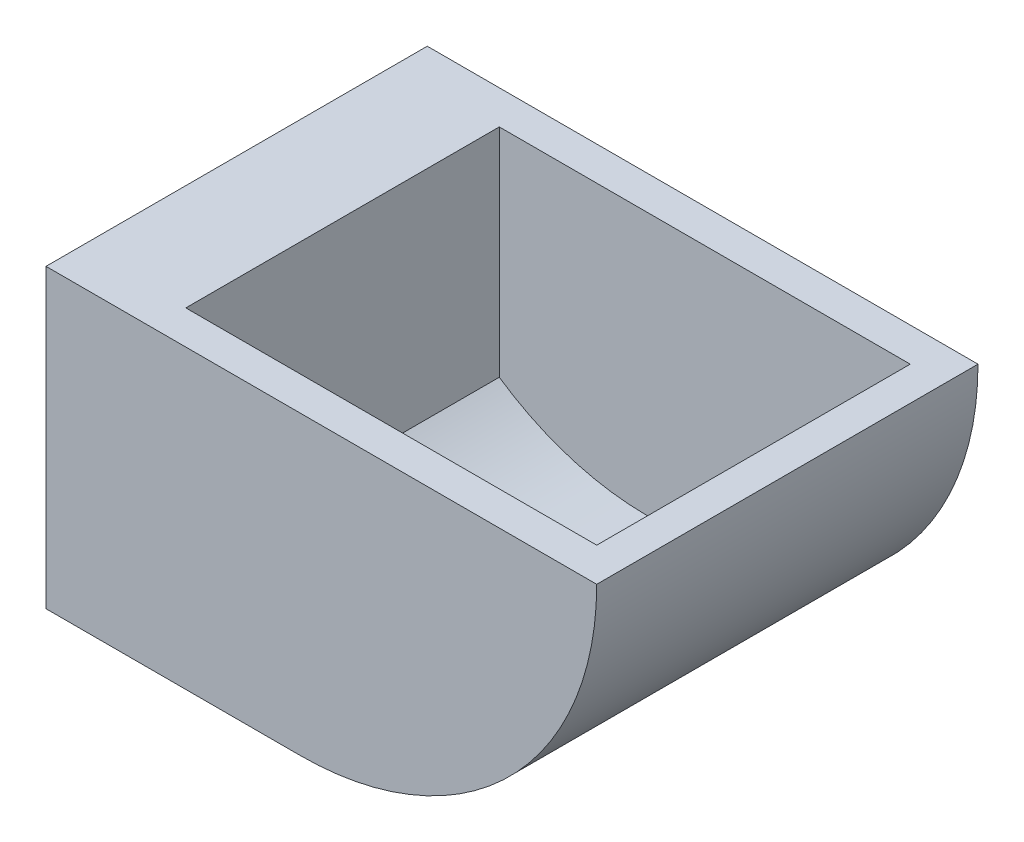
ISO-10303-21;
HEADER;
FILE_DESCRIPTION(('STEP AP214'),'2;1');
FILE_NAME('part.step','',(''),(''),'','','');
FILE_SCHEMA(('AUTOMOTIVE_DESIGN { 1 0 10303 214 1 1 1 1 }'));
ENDSEC;
DATA;
#1=APPLICATION_CONTEXT('core data for automotive mechanical design processes');
#2=APPLICATION_PROTOCOL_DEFINITION('international standard','automotive_design',2000,#1);
#3=PRODUCT_CONTEXT('',#1,'mechanical');
#4=PRODUCT('Part','Part','',(#3));
#5=PRODUCT_RELATED_PRODUCT_CATEGORY('part','',(#4));
#6=PRODUCT_DEFINITION_FORMATION('','',#4);
#7=PRODUCT_DEFINITION_CONTEXT('part definition',#1,'design');
#8=PRODUCT_DEFINITION('design','',#6,#7);
#9=PRODUCT_DEFINITION_SHAPE('','',#8);
#10=(LENGTH_UNIT() NAMED_UNIT(*) SI_UNIT(.MILLI.,.METRE.));
#11=(NAMED_UNIT(*) PLANE_ANGLE_UNIT() SI_UNIT($,.RADIAN.));
#12=(NAMED_UNIT(*) SI_UNIT($,.STERADIAN.) SOLID_ANGLE_UNIT());
#13=UNCERTAINTY_MEASURE_WITH_UNIT(LENGTH_MEASURE(1.E-05),#10,'distance_accuracy_value','');
#14=(GEOMETRIC_REPRESENTATION_CONTEXT(3) GLOBAL_UNCERTAINTY_ASSIGNED_CONTEXT((#13)) GLOBAL_UNIT_ASSIGNED_CONTEXT((#10,
#11,#12)) REPRESENTATION_CONTEXT('',''));
#15=CARTESIAN_POINT('',(0.,0.,0.));
#16=DIRECTION('',(0.,0.,1.));
#17=DIRECTION('',(1.,0.,0.));
#18=AXIS2_PLACEMENT_3D('',#15,#16,#17);
#19=CARTESIAN_POINT('',(0.,0.,45.));
#20=DIRECTION('',(0.,0.,-1.));
#21=DIRECTION('',(-1.,0.,0.));
#22=AXIS2_PLACEMENT_3D('',#19,#20,#21);
#23=CYLINDRICAL_SURFACE('',#22,35.);
#24=CARTESIAN_POINT('',(0.,0.,45.));
#25=DIRECTION('',(0.,0.,1.));
#26=DIRECTION('',(1.,0.,0.));
#27=AXIS2_PLACEMENT_3D('',#24,#25,#26);
#28=CIRCLE('',#27,35.);
#29=CARTESIAN_POINT('',(0.,-35.,45.));
#30=VERTEX_POINT('',#29);
#31=CARTESIAN_POINT('',(35.,0.,45.));
#32=VERTEX_POINT('',#31);
#33=EDGE_CURVE('E125',#30,#32,#28,.T.);
#34=ORIENTED_EDGE('',*,*,#33,.F.);
#35=DIRECTION('',(0.,0.,1.));
#36=VECTOR('',#35,1.);
#37=CARTESIAN_POINT('',(0.,-35.,0.));
#38=LINE('',#37,#36);
#39=CARTESIAN_POINT('',(0.,-35.,0.));
#40=VERTEX_POINT('',#39);
#41=EDGE_CURVE('E178',#40,#30,#38,.T.);
#42=ORIENTED_EDGE('',*,*,#41,.F.);
#43=CARTESIAN_POINT('',(0.,0.,0.));
#44=DIRECTION('',(0.,0.,1.));
#45=DIRECTION('',(1.,0.,0.));
#46=AXIS2_PLACEMENT_3D('',#43,#44,#45);
#47=CIRCLE('',#46,35.);
#48=CARTESIAN_POINT('',(35.,0.,0.));
#49=VERTEX_POINT('',#48);
#50=EDGE_CURVE('E128',#40,#49,#47,.T.);
#51=ORIENTED_EDGE('',*,*,#50,.T.);
#52=DIRECTION('',(0.,0.,-1.));
#53=VECTOR('',#52,1.);
#54=CARTESIAN_POINT('',(35.,0.,45.));
#55=LINE('',#54,#53);
#56=EDGE_CURVE('E132',#32,#49,#55,.T.);
#57=ORIENTED_EDGE('',*,*,#56,.F.);
#58=EDGE_LOOP('',(#34,#42,#51,#57));
#59=FACE_BOUND('',#58,.T.);
#60=ADVANCED_FACE('F47',(#59),#23,.T.);
#61=CARTESIAN_POINT('',(0.,0.,4.));
#62=DIRECTION('',(0.,0.,1.));
#63=DIRECTION('',(1.,0.,0.));
#64=AXIS2_PLACEMENT_3D('',#61,#62,#63);
#65=PLANE('',#64);
#66=DIRECTION('',(1.,0.,0.));
#67=VECTOR('',#66,1.);
#68=CARTESIAN_POINT('',(0.,0.,4.));
#69=LINE('',#68,#67);
#70=CARTESIAN_POINT('',(-17.5,0.,4.));
#71=VERTEX_POINT('',#70);
#72=CARTESIAN_POINT('',(31.,0.,4.));
#73=VERTEX_POINT('',#72);
#74=EDGE_CURVE('E57',#71,#73,#69,.T.);
#75=ORIENTED_EDGE('',*,*,#74,.F.);
#76=DIRECTION('',(0.,-1.,0.));
#77=VECTOR('',#76,1.);
#78=CARTESIAN_POINT('',(-17.5,0.,4.));
#79=LINE('',#78,#77);
#80=CARTESIAN_POINT('',(-17.5,-25.588083163848,4.));
#81=VERTEX_POINT('',#80);
#82=EDGE_CURVE('E168',#71,#81,#79,.T.);
#83=ORIENTED_EDGE('',*,*,#82,.T.);
#84=CARTESIAN_POINT('',(0.,0.,4.));
#85=DIRECTION('',(0.,0.,-1.));
#86=DIRECTION('',(-1.,0.,0.));
#87=AXIS2_PLACEMENT_3D('',#84,#85,#86);
#88=CIRCLE('',#87,31.);
#89=EDGE_CURVE('E137',#73,#81,#88,.T.);
#90=ORIENTED_EDGE('',*,*,#89,.F.);
#91=EDGE_LOOP('',(#75,#83,#90));
#92=FACE_BOUND('',#91,.T.);
#93=ADVANCED_FACE('F167',(#92),#65,.T.);
#94=CARTESIAN_POINT('',(0.,0.,0.));
#95=DIRECTION('',(0.,0.,-1.));
#96=DIRECTION('',(-1.,0.,0.));
#97=AXIS2_PLACEMENT_3D('',#94,#95,#96);
#98=CYLINDRICAL_SURFACE('',#97,31.);
#99=DIRECTION('',(0.,0.,-1.));
#100=VECTOR('',#99,1.);
#101=CARTESIAN_POINT('',(-17.5,-25.588083163848,0.));
#102=LINE('',#101,#100);
#103=CARTESIAN_POINT('',(-17.5,-25.588083163848,41.));
#104=VERTEX_POINT('',#103);
#105=EDGE_CURVE('E173',#104,#81,#102,.T.);
#106=ORIENTED_EDGE('',*,*,#105,.F.);
#107=CARTESIAN_POINT('',(0.,0.,41.));
#108=DIRECTION('',(0.,0.,-1.));
#109=DIRECTION('',(-1.,0.,0.));
#110=AXIS2_PLACEMENT_3D('',#107,#108,#109);
#111=CIRCLE('',#110,31.);
#112=CARTESIAN_POINT('',(31.,0.,41.));
#113=VERTEX_POINT('',#112);
#114=EDGE_CURVE('E166',#113,#104,#111,.T.);
#115=ORIENTED_EDGE('',*,*,#114,.F.);
#116=DIRECTION('',(0.,0.,-1.));
#117=VECTOR('',#116,1.);
#118=CARTESIAN_POINT('',(31.,0.,0.));
#119=LINE('',#118,#117);
#120=EDGE_CURVE('E147',#113,#73,#119,.T.);
#121=ORIENTED_EDGE('',*,*,#120,.T.);
#122=ORIENTED_EDGE('',*,*,#89,.T.);
#123=EDGE_LOOP('',(#106,#115,#121,#122));
#124=FACE_BOUND('',#123,.T.);
#125=ADVANCED_FACE('F164',(#124),#98,.F.);
#126=CARTESIAN_POINT('',(0.,0.,41.));
#127=DIRECTION('',(0.,0.,1.));
#128=DIRECTION('',(1.,0.,0.));
#129=AXIS2_PLACEMENT_3D('',#126,#127,#128);
#130=PLANE('',#129);
#131=DIRECTION('',(0.,-1.,0.));
#132=VECTOR('',#131,1.);
#133=CARTESIAN_POINT('',(-17.5,0.,41.));
#134=LINE('',#133,#132);
#135=CARTESIAN_POINT('',(-17.5,0.,41.));
#136=VERTEX_POINT('',#135);
#137=EDGE_CURVE('E11',#136,#104,#134,.T.);
#138=ORIENTED_EDGE('',*,*,#137,.F.);
#139=DIRECTION('',(1.,0.,0.));
#140=VECTOR('',#139,1.);
#141=CARTESIAN_POINT('',(0.,0.,41.));
#142=LINE('',#141,#140);
#143=EDGE_CURVE('E144',#136,#113,#142,.T.);
#144=ORIENTED_EDGE('',*,*,#143,.T.);
#145=ORIENTED_EDGE('',*,*,#114,.T.);
#146=EDGE_LOOP('',(#138,#144,#145));
#147=FACE_BOUND('',#146,.T.);
#148=ADVANCED_FACE('F242',(#147),#130,.F.);
#149=CARTESIAN_POINT('',(0.,0.,45.));
#150=DIRECTION('',(0.,1.,0.));
#151=DIRECTION('',(0.,0.,1.));
#152=AXIS2_PLACEMENT_3D('',#149,#150,#151);
#153=PLANE('',#152);
#154=DIRECTION('',(0.,0.,-1.));
#155=VECTOR('',#154,1.);
#156=CARTESIAN_POINT('',(-30.,0.,45.));
#157=LINE('',#156,#155);
#158=CARTESIAN_POINT('',(-30.,0.,45.));
#159=VERTEX_POINT('',#158);
#160=CARTESIAN_POINT('',(-30.,0.,0.));
#161=VERTEX_POINT('',#160);
#162=EDGE_CURVE('E111',#159,#161,#157,.T.);
#163=ORIENTED_EDGE('',*,*,#162,.F.);
#164=DIRECTION('',(1.,0.,0.));
#165=VECTOR('',#164,1.);
#166=CARTESIAN_POINT('',(0.,0.,45.));
#167=LINE('',#166,#165);
#168=EDGE_CURVE('E120',#159,#32,#167,.T.);
#169=ORIENTED_EDGE('',*,*,#168,.T.);
#170=ORIENTED_EDGE('',*,*,#56,.T.);
#171=DIRECTION('',(1.,0.,0.));
#172=VECTOR('',#171,1.);
#173=CARTESIAN_POINT('',(0.,0.,0.));
#174=LINE('',#173,#172);
#175=EDGE_CURVE('E121',#161,#49,#174,.T.);
#176=ORIENTED_EDGE('',*,*,#175,.F.);
#177=EDGE_LOOP('',(#163,#169,#170,#176));
#178=FACE_BOUND('',#177,.T.);
#179=DIRECTION('',(0.,0.,1.));
#180=VECTOR('',#179,1.);
#181=CARTESIAN_POINT('',(-17.5,0.,0.));
#182=LINE('',#181,#180);
#183=EDGE_CURVE('E156',#71,#136,#182,.T.);
#184=ORIENTED_EDGE('',*,*,#183,.F.);
#185=ORIENTED_EDGE('',*,*,#74,.T.);
#186=ORIENTED_EDGE('',*,*,#120,.F.);
#187=ORIENTED_EDGE('',*,*,#143,.F.);
#188=EDGE_LOOP('',(#184,#185,#186,#187));
#189=FACE_BOUND('',#188,.T.);
#190=ADVANCED_FACE('F49',(#178,#189),#153,.T.);
#191=CARTESIAN_POINT('',(0.,0.,45.));
#192=DIRECTION('',(0.,0.,1.));
#193=DIRECTION('',(1.,0.,0.));
#194=AXIS2_PLACEMENT_3D('',#191,#192,#193);
#195=PLANE('',#194);
#196=DIRECTION('',(0.,-1.,0.));
#197=VECTOR('',#196,1.);
#198=CARTESIAN_POINT('',(-30.,0.,45.));
#199=LINE('',#198,#197);
#200=CARTESIAN_POINT('',(-30.,-35.,45.));
#201=VERTEX_POINT('',#200);
#202=EDGE_CURVE('E107',#159,#201,#199,.T.);
#203=ORIENTED_EDGE('',*,*,#202,.T.);
#204=DIRECTION('',(1.,0.,0.));
#205=VECTOR('',#204,1.);
#206=CARTESIAN_POINT('',(0.,-35.,45.));
#207=LINE('',#206,#205);
#208=EDGE_CURVE('E72',#201,#30,#207,.T.);
#209=ORIENTED_EDGE('',*,*,#208,.T.);
#210=ORIENTED_EDGE('',*,*,#33,.T.);
#211=ORIENTED_EDGE('',*,*,#168,.F.);
#212=EDGE_LOOP('',(#203,#209,#210,#211));
#213=FACE_BOUND('',#212,.T.);
#214=ADVANCED_FACE('F124',(#213),#195,.T.);
#215=CARTESIAN_POINT('',(0.,0.,0.));
#216=DIRECTION('',(0.,0.,1.));
#217=DIRECTION('',(1.,0.,0.));
#218=AXIS2_PLACEMENT_3D('',#215,#216,#217);
#219=PLANE('',#218);
#220=DIRECTION('',(1.,0.,0.));
#221=VECTOR('',#220,1.);
#222=CARTESIAN_POINT('',(0.,-35.,0.));
#223=LINE('',#222,#221);
#224=CARTESIAN_POINT('',(-30.,-35.,0.));
#225=VERTEX_POINT('',#224);
#226=EDGE_CURVE('E181',#225,#40,#223,.T.);
#227=ORIENTED_EDGE('',*,*,#226,.F.);
#228=DIRECTION('',(0.,-1.,0.));
#229=VECTOR('',#228,1.);
#230=CARTESIAN_POINT('',(-30.,0.,0.));
#231=LINE('',#230,#229);
#232=EDGE_CURVE('E64',#161,#225,#231,.T.);
#233=ORIENTED_EDGE('',*,*,#232,.F.);
#234=ORIENTED_EDGE('',*,*,#175,.T.);
#235=ORIENTED_EDGE('',*,*,#50,.F.);
#236=EDGE_LOOP('',(#227,#233,#234,#235));
#237=FACE_BOUND('',#236,.T.);
#238=ADVANCED_FACE('F234',(#237),#219,.F.);
#239=CARTESIAN_POINT('',(-17.5,0.,0.));
#240=DIRECTION('',(-1.,0.,0.));
#241=DIRECTION('',(0.,0.,1.));
#242=AXIS2_PLACEMENT_3D('',#239,#240,#241);
#243=PLANE('',#242);
#244=ORIENTED_EDGE('',*,*,#82,.F.);
#245=ORIENTED_EDGE('',*,*,#183,.T.);
#246=ORIENTED_EDGE('',*,*,#137,.T.);
#247=ORIENTED_EDGE('',*,*,#105,.T.);
#248=EDGE_LOOP('',(#244,#245,#246,#247));
#249=FACE_BOUND('',#248,.T.);
#250=ADVANCED_FACE('F223',(#249),#243,.F.);
#251=CARTESIAN_POINT('',(0.,-35.,0.));
#252=DIRECTION('',(0.,-1.,0.));
#253=DIRECTION('',(0.,0.,-1.));
#254=AXIS2_PLACEMENT_3D('',#251,#252,#253);
#255=PLANE('',#254);
#256=DIRECTION('',(0.,0.,-1.));
#257=VECTOR('',#256,1.);
#258=CARTESIAN_POINT('',(-30.,-35.,45.));
#259=LINE('',#258,#257);
#260=EDGE_CURVE('E112',#201,#225,#259,.T.);
#261=ORIENTED_EDGE('',*,*,#260,.T.);
#262=ORIENTED_EDGE('',*,*,#226,.T.);
#263=ORIENTED_EDGE('',*,*,#41,.T.);
#264=ORIENTED_EDGE('',*,*,#208,.F.);
#265=EDGE_LOOP('',(#261,#262,#263,#264));
#266=FACE_BOUND('',#265,.T.);
#267=ADVANCED_FACE('F213',(#266),#255,.T.);
#268=CARTESIAN_POINT('',(-30.,0.,45.));
#269=DIRECTION('',(1.,0.,0.));
#270=DIRECTION('',(0.,1.,0.));
#271=AXIS2_PLACEMENT_3D('',#268,#269,#270);
#272=PLANE('',#271);
#273=CARTESIAN_POINT('',(-30.,-17.5,10.));
#274=DIRECTION('',(1.,0.,0.));
#275=DIRECTION('',(0.,1.,0.));
#276=AXIS2_PLACEMENT_3D('',#273,#274,#275);
#277=CIRCLE('',#276,5.15);
#278=CARTESIAN_POINT('',(-30.,-12.35,10.));
#279=VERTEX_POINT('',#278);
#280=EDGE_CURVE('E51',#279,#279,#277,.F.);
#281=ORIENTED_EDGE('',*,*,#280,.F.);
#282=EDGE_LOOP('',(#281));
#283=FACE_BOUND('',#282,.T.);
#284=ORIENTED_EDGE('',*,*,#232,.T.);
#285=ORIENTED_EDGE('',*,*,#260,.F.);
#286=ORIENTED_EDGE('',*,*,#202,.F.);
#287=ORIENTED_EDGE('',*,*,#162,.T.);
#288=EDGE_LOOP('',(#284,#285,#286,#287));
#289=FACE_BOUND('',#288,.T.);
#290=CARTESIAN_POINT('',(-30.,-17.5,35.));
#291=DIRECTION('',(1.,0.,0.));
#292=DIRECTION('',(0.,1.,0.));
#293=AXIS2_PLACEMENT_3D('',#290,#291,#292);
#294=CIRCLE('',#293,5.15);
#295=CARTESIAN_POINT('',(-30.,-12.35,35.));
#296=VERTEX_POINT('',#295);
#297=EDGE_CURVE('E194',#296,#296,#294,.F.);
#298=ORIENTED_EDGE('',*,*,#297,.F.);
#299=EDGE_LOOP('',(#298));
#300=FACE_BOUND('',#299,.T.);
#301=ADVANCED_FACE('F109',(#283,#289,#300),#272,.F.);
#302=CARTESIAN_POINT('',(-23.,-17.5,35.));
#303=DIRECTION('',(1.,0.,0.));
#304=DIRECTION('',(0.,0.,-1.));
#305=AXIS2_PLACEMENT_3D('',#302,#303,#304);
#306=PLANE('',#305);
#307=CARTESIAN_POINT('',(-23.,-17.5,35.));
#308=DIRECTION('',(-1.,0.,0.));
#309=DIRECTION('',(0.,0.,-1.));
#310=AXIS2_PLACEMENT_3D('',#307,#308,#309);
#311=CIRCLE('',#310,5.15);
#312=CARTESIAN_POINT('',(-23.,-17.5,29.85));
#313=VERTEX_POINT('',#312);
#314=EDGE_CURVE('E190',#313,#313,#311,.T.);
#315=ORIENTED_EDGE('',*,*,#314,.T.);
#316=EDGE_LOOP('',(#315));
#317=FACE_BOUND('',#316,.T.);
#318=ADVANCED_FACE('F212',(#317),#306,.F.);
#319=CARTESIAN_POINT('',(-23.,-17.5,35.));
#320=DIRECTION('',(-1.,0.,0.));
#321=DIRECTION('',(0.,0.,1.));
#322=AXIS2_PLACEMENT_3D('',#319,#320,#321);
#323=CYLINDRICAL_SURFACE('',#322,5.15);
#324=ORIENTED_EDGE('',*,*,#297,.T.);
#325=EDGE_LOOP('',(#324));
#326=FACE_BOUND('',#325,.T.);
#327=ORIENTED_EDGE('',*,*,#314,.F.);
#328=EDGE_LOOP('',(#327));
#329=FACE_BOUND('',#328,.T.);
#330=ADVANCED_FACE('F220',(#326,#329),#323,.F.);
#331=CARTESIAN_POINT('',(-23.,-17.5,10.));
#332=DIRECTION('',(-1.,0.,0.));
#333=DIRECTION('',(0.,0.,1.));
#334=AXIS2_PLACEMENT_3D('',#331,#332,#333);
#335=PLANE('',#334);
#336=CARTESIAN_POINT('',(-23.,-17.5,10.));
#337=DIRECTION('',(-1.,0.,0.));
#338=DIRECTION('',(0.,0.,1.));
#339=AXIS2_PLACEMENT_3D('',#336,#337,#338);
#340=CIRCLE('',#339,5.15);
#341=CARTESIAN_POINT('',(-23.,-17.5,15.15));
#342=VERTEX_POINT('',#341);
#343=EDGE_CURVE('E187',#342,#342,#340,.T.);
#344=ORIENTED_EDGE('',*,*,#343,.T.);
#345=EDGE_LOOP('',(#344));
#346=FACE_BOUND('',#345,.T.);
#347=ADVANCED_FACE('F249',(#346),#335,.T.);
#348=CARTESIAN_POINT('',(-23.,-17.5,10.));
#349=DIRECTION('',(-1.,0.,0.));
#350=DIRECTION('',(0.,0.,1.));
#351=AXIS2_PLACEMENT_3D('',#348,#349,#350);
#352=CYLINDRICAL_SURFACE('',#351,5.15);
#353=ORIENTED_EDGE('',*,*,#280,.T.);
#354=EDGE_LOOP('',(#353));
#355=FACE_BOUND('',#354,.T.);
#356=ORIENTED_EDGE('',*,*,#343,.F.);
#357=EDGE_LOOP('',(#356));
#358=FACE_BOUND('',#357,.T.);
#359=ADVANCED_FACE('F208',(#355,#358),#352,.F.);
#360=CLOSED_SHELL('',(#60,#93,#125,#148,#190,#214,#238,#250,#267,#301,#318,#330,#347,#359));
#361=MANIFOLD_SOLID_BREP('B2',#360);
#362=ADVANCED_BREP_SHAPE_REPRESENTATION('',(#18,#361),#14);
#363=SHAPE_DEFINITION_REPRESENTATION(#9,#362);
ENDSEC;
END-ISO-10303-21;
